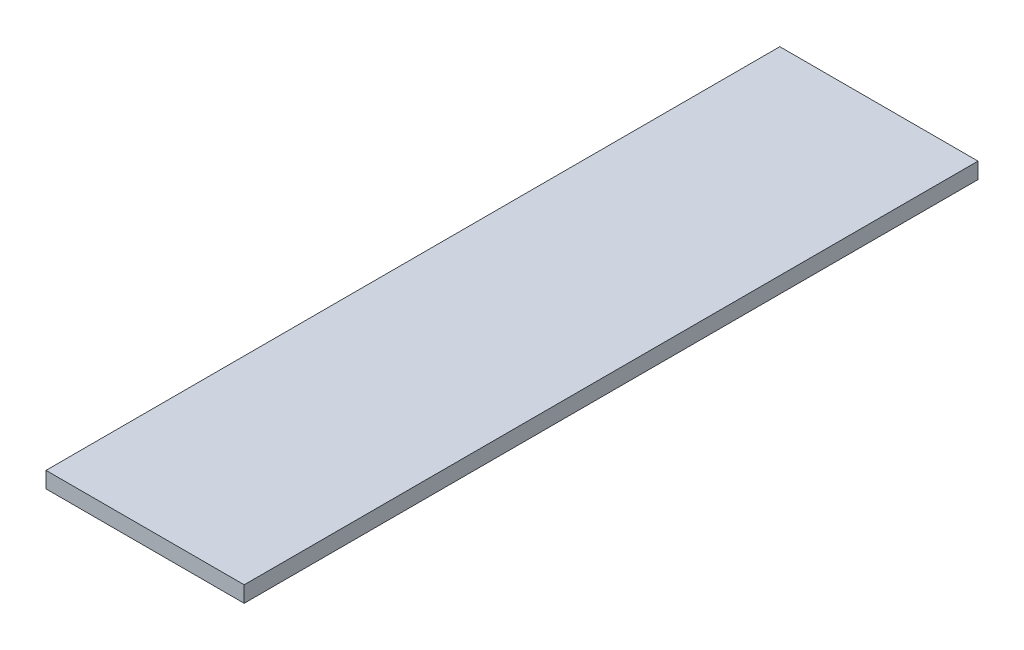
ISO-10303-21;
HEADER;
FILE_DESCRIPTION(('STEP AP214'),'2;1');
FILE_NAME('part.step','',(''),(''),'','','');
FILE_SCHEMA(('AUTOMOTIVE_DESIGN { 1 0 10303 214 1 1 1 1 }'));
ENDSEC;
DATA;
#1=APPLICATION_CONTEXT('core data for automotive mechanical design processes');
#2=APPLICATION_PROTOCOL_DEFINITION('international standard','automotive_design',2000,#1);
#3=PRODUCT_CONTEXT('',#1,'mechanical');
#4=PRODUCT('Part','Part','',(#3));
#5=PRODUCT_RELATED_PRODUCT_CATEGORY('part','',(#4));
#6=PRODUCT_DEFINITION_FORMATION('','',#4);
#7=PRODUCT_DEFINITION_CONTEXT('part definition',#1,'design');
#8=PRODUCT_DEFINITION('design','',#6,#7);
#9=PRODUCT_DEFINITION_SHAPE('','',#8);
#10=(LENGTH_UNIT() NAMED_UNIT(*) SI_UNIT(.MILLI.,.METRE.));
#11=(NAMED_UNIT(*) PLANE_ANGLE_UNIT() SI_UNIT($,.RADIAN.));
#12=(NAMED_UNIT(*) SI_UNIT($,.STERADIAN.) SOLID_ANGLE_UNIT());
#13=UNCERTAINTY_MEASURE_WITH_UNIT(LENGTH_MEASURE(1.E-05),#10,'distance_accuracy_value','');
#14=(GEOMETRIC_REPRESENTATION_CONTEXT(3) GLOBAL_UNCERTAINTY_ASSIGNED_CONTEXT((#13)) GLOBAL_UNIT_ASSIGNED_CONTEXT((#10,
#11,#12)) REPRESENTATION_CONTEXT('',''));
#15=CARTESIAN_POINT('',(0.,0.,0.));
#16=DIRECTION('',(0.,0.,1.));
#17=DIRECTION('',(1.,0.,0.));
#18=AXIS2_PLACEMENT_3D('',#15,#16,#17);
#19=CARTESIAN_POINT('',(37.,6.,137.));
#20=DIRECTION('',(-1.,0.,0.));
#21=DIRECTION('',(0.,0.,1.));
#22=AXIS2_PLACEMENT_3D('',#19,#20,#21);
#23=PLANE('',#22);
#24=DIRECTION('',(0.,0.,-1.));
#25=VECTOR('',#24,1.);
#26=CARTESIAN_POINT('',(37.,0.,137.));
#27=LINE('',#26,#25);
#28=CARTESIAN_POINT('',(37.,0.,137.));
#29=VERTEX_POINT('',#28);
#30=CARTESIAN_POINT('',(37.,0.,-137.));
#31=VERTEX_POINT('',#30);
#32=EDGE_CURVE('E95',#29,#31,#27,.T.);
#33=ORIENTED_EDGE('',*,*,#32,.T.);
#34=DIRECTION('',(0.,-1.,0.));
#35=VECTOR('',#34,1.);
#36=CARTESIAN_POINT('',(37.,6.,-137.));
#37=LINE('',#36,#35);
#38=CARTESIAN_POINT('',(37.,6.,-137.));
#39=VERTEX_POINT('',#38);
#40=EDGE_CURVE('E11',#39,#31,#37,.T.);
#41=ORIENTED_EDGE('',*,*,#40,.F.);
#42=DIRECTION('',(0.,0.,-1.));
#43=VECTOR('',#42,1.);
#44=CARTESIAN_POINT('',(37.,6.,137.));
#45=LINE('',#44,#43);
#46=CARTESIAN_POINT('',(37.,6.,137.));
#47=VERTEX_POINT('',#46);
#48=EDGE_CURVE('E83',#47,#39,#45,.T.);
#49=ORIENTED_EDGE('',*,*,#48,.F.);
#50=DIRECTION('',(0.,-1.,0.));
#51=VECTOR('',#50,1.);
#52=CARTESIAN_POINT('',(37.,6.,137.));
#53=LINE('',#52,#51);
#54=EDGE_CURVE('E91',#47,#29,#53,.T.);
#55=ORIENTED_EDGE('',*,*,#54,.T.);
#56=EDGE_LOOP('',(#33,#41,#49,#55));
#57=FACE_BOUND('',#56,.T.);
#58=ADVANCED_FACE('F32',(#57),#23,.F.);
#59=CARTESIAN_POINT('',(-37.,6.,-137.));
#60=DIRECTION('',(0.,0.,1.));
#61=DIRECTION('',(1.,0.,0.));
#62=AXIS2_PLACEMENT_3D('',#59,#60,#61);
#63=PLANE('',#62);
#64=DIRECTION('',(-1.,0.,0.));
#65=VECTOR('',#64,1.);
#66=CARTESIAN_POINT('',(-37.,0.,-137.));
#67=LINE('',#66,#65);
#68=CARTESIAN_POINT('',(-37.,0.,-137.));
#69=VERTEX_POINT('',#68);
#70=EDGE_CURVE('E87',#31,#69,#67,.T.);
#71=ORIENTED_EDGE('',*,*,#70,.T.);
#72=DIRECTION('',(0.,-1.,0.));
#73=VECTOR('',#72,1.);
#74=CARTESIAN_POINT('',(-37.,6.,-137.));
#75=LINE('',#74,#73);
#76=CARTESIAN_POINT('',(-37.,6.,-137.));
#77=VERTEX_POINT('',#76);
#78=EDGE_CURVE('E40',#77,#69,#75,.T.);
#79=ORIENTED_EDGE('',*,*,#78,.F.);
#80=DIRECTION('',(-1.,0.,0.));
#81=VECTOR('',#80,1.);
#82=CARTESIAN_POINT('',(-37.,6.,-137.));
#83=LINE('',#82,#81);
#84=EDGE_CURVE('E78',#39,#77,#83,.T.);
#85=ORIENTED_EDGE('',*,*,#84,.F.);
#86=ORIENTED_EDGE('',*,*,#40,.T.);
#87=EDGE_LOOP('',(#71,#79,#85,#86));
#88=FACE_BOUND('',#87,.T.);
#89=ADVANCED_FACE('F86',(#88),#63,.F.);
#90=CARTESIAN_POINT('',(-37.,6.,137.));
#91=DIRECTION('',(1.,0.,0.));
#92=DIRECTION('',(0.,0.,-1.));
#93=AXIS2_PLACEMENT_3D('',#90,#91,#92);
#94=PLANE('',#93);
#95=DIRECTION('',(0.,0.,1.));
#96=VECTOR('',#95,1.);
#97=CARTESIAN_POINT('',(-37.,0.,137.));
#98=LINE('',#97,#96);
#99=CARTESIAN_POINT('',(-37.,0.,137.));
#100=VERTEX_POINT('',#99);
#101=EDGE_CURVE('E65',#69,#100,#98,.T.);
#102=ORIENTED_EDGE('',*,*,#101,.T.);
#103=DIRECTION('',(0.,-1.,0.));
#104=VECTOR('',#103,1.);
#105=CARTESIAN_POINT('',(-37.,6.,137.));
#106=LINE('',#105,#104);
#107=CARTESIAN_POINT('',(-37.,6.,137.));
#108=VERTEX_POINT('',#107);
#109=EDGE_CURVE('E88',#108,#100,#106,.T.);
#110=ORIENTED_EDGE('',*,*,#109,.F.);
#111=DIRECTION('',(0.,0.,1.));
#112=VECTOR('',#111,1.);
#113=CARTESIAN_POINT('',(-37.,6.,137.));
#114=LINE('',#113,#112);
#115=EDGE_CURVE('E81',#77,#108,#114,.T.);
#116=ORIENTED_EDGE('',*,*,#115,.F.);
#117=ORIENTED_EDGE('',*,*,#78,.T.);
#118=EDGE_LOOP('',(#102,#110,#116,#117));
#119=FACE_BOUND('',#118,.T.);
#120=ADVANCED_FACE('F89',(#119),#94,.F.);
#121=CARTESIAN_POINT('',(-37.,6.,137.));
#122=DIRECTION('',(0.,0.,-1.));
#123=DIRECTION('',(-1.,0.,0.));
#124=AXIS2_PLACEMENT_3D('',#121,#122,#123);
#125=PLANE('',#124);
#126=DIRECTION('',(1.,0.,0.));
#127=VECTOR('',#126,1.);
#128=CARTESIAN_POINT('',(-37.,0.,137.));
#129=LINE('',#128,#127);
#130=EDGE_CURVE('E71',#100,#29,#129,.T.);
#131=ORIENTED_EDGE('',*,*,#130,.T.);
#132=ORIENTED_EDGE('',*,*,#54,.F.);
#133=DIRECTION('',(1.,0.,0.));
#134=VECTOR('',#133,1.);
#135=CARTESIAN_POINT('',(-37.,6.,137.));
#136=LINE('',#135,#134);
#137=EDGE_CURVE('E48',#108,#47,#136,.T.);
#138=ORIENTED_EDGE('',*,*,#137,.F.);
#139=ORIENTED_EDGE('',*,*,#109,.T.);
#140=EDGE_LOOP('',(#131,#132,#138,#139));
#141=FACE_BOUND('',#140,.T.);
#142=ADVANCED_FACE('F102',(#141),#125,.F.);
#143=CARTESIAN_POINT('',(0.,6.,0.));
#144=DIRECTION('',(0.,-1.,0.));
#145=DIRECTION('',(0.,0.,-1.));
#146=AXIS2_PLACEMENT_3D('',#143,#144,#145);
#147=PLANE('',#146);
#148=ORIENTED_EDGE('',*,*,#48,.T.);
#149=ORIENTED_EDGE('',*,*,#84,.T.);
#150=ORIENTED_EDGE('',*,*,#115,.T.);
#151=ORIENTED_EDGE('',*,*,#137,.T.);
#152=EDGE_LOOP('',(#148,#149,#150,#151));
#153=FACE_BOUND('',#152,.T.);
#154=ADVANCED_FACE('F79',(#153),#147,.F.);
#155=CARTESIAN_POINT('',(0.,0.,0.));
#156=DIRECTION('',(0.,-1.,0.));
#157=DIRECTION('',(0.,0.,-1.));
#158=AXIS2_PLACEMENT_3D('',#155,#156,#157);
#159=PLANE('',#158);
#160=ORIENTED_EDGE('',*,*,#32,.F.);
#161=ORIENTED_EDGE('',*,*,#130,.F.);
#162=ORIENTED_EDGE('',*,*,#101,.F.);
#163=ORIENTED_EDGE('',*,*,#70,.F.);
#164=EDGE_LOOP('',(#160,#161,#162,#163));
#165=FACE_BOUND('',#164,.T.);
#166=ADVANCED_FACE('F105',(#165),#159,.T.);
#167=CLOSED_SHELL('',(#58,#89,#120,#142,#154,#166));
#168=MANIFOLD_SOLID_BREP('B2',#167);
#169=ADVANCED_BREP_SHAPE_REPRESENTATION('',(#18,#168),#14);
#170=SHAPE_DEFINITION_REPRESENTATION(#9,#169);
ENDSEC;
END-ISO-10303-21;
